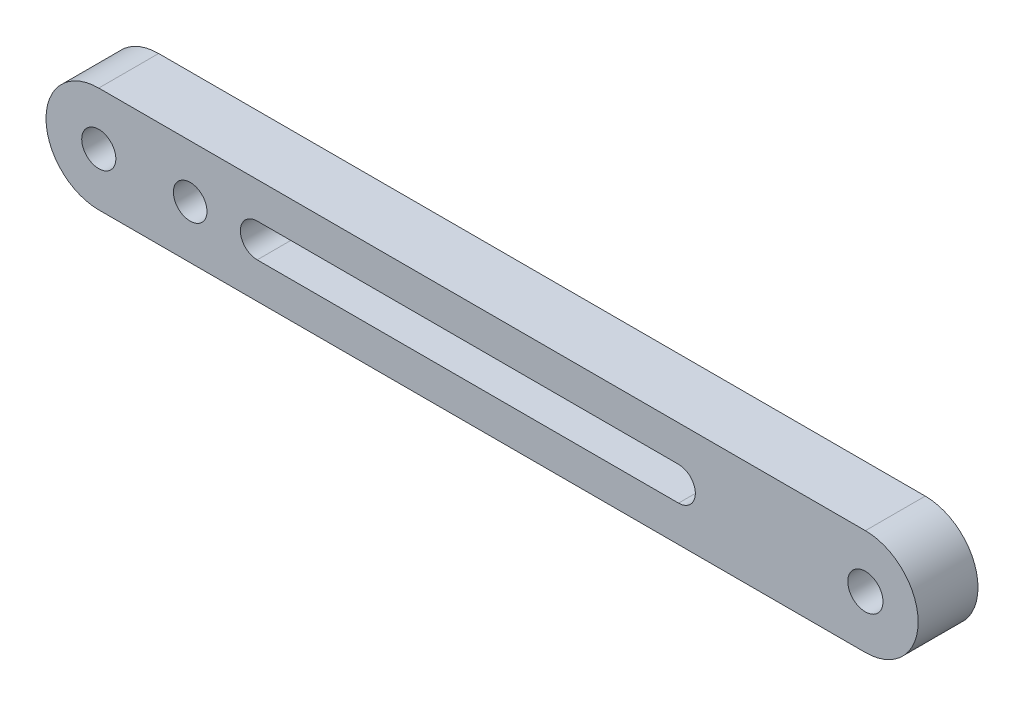
ISO-10303-21;
HEADER;
FILE_DESCRIPTION(('STEP AP214'),'2;1');
FILE_NAME('part.step','',(''),(''),'','','');
FILE_SCHEMA(('AUTOMOTIVE_DESIGN { 1 0 10303 214 1 1 1 1 }'));
ENDSEC;
DATA;
#1=APPLICATION_CONTEXT('core data for automotive mechanical design processes');
#2=APPLICATION_PROTOCOL_DEFINITION('international standard','automotive_design',2000,#1);
#3=PRODUCT_CONTEXT('',#1,'mechanical');
#4=PRODUCT('Part','Part','',(#3));
#5=PRODUCT_RELATED_PRODUCT_CATEGORY('part','',(#4));
#6=PRODUCT_DEFINITION_FORMATION('','',#4);
#7=PRODUCT_DEFINITION_CONTEXT('part definition',#1,'design');
#8=PRODUCT_DEFINITION('design','',#6,#7);
#9=PRODUCT_DEFINITION_SHAPE('','',#8);
#10=(LENGTH_UNIT() NAMED_UNIT(*) SI_UNIT(.MILLI.,.METRE.));
#11=(NAMED_UNIT(*) PLANE_ANGLE_UNIT() SI_UNIT($,.RADIAN.));
#12=(NAMED_UNIT(*) SI_UNIT($,.STERADIAN.) SOLID_ANGLE_UNIT());
#13=UNCERTAINTY_MEASURE_WITH_UNIT(LENGTH_MEASURE(1.E-05),#10,'distance_accuracy_value','');
#14=(GEOMETRIC_REPRESENTATION_CONTEXT(3) GLOBAL_UNCERTAINTY_ASSIGNED_CONTEXT((#13)) GLOBAL_UNIT_ASSIGNED_CONTEXT((#10,
#11,#12)) REPRESENTATION_CONTEXT('',''));
#15=CARTESIAN_POINT('',(0.,0.,0.));
#16=DIRECTION('',(0.,0.,1.));
#17=DIRECTION('',(1.,0.,0.));
#18=AXIS2_PLACEMENT_3D('',#15,#16,#17);
#19=CARTESIAN_POINT('',(49.4529730298948,15.8760123838213,19.6628463018496));
#20=DIRECTION('',(0.,0.,-1.));
#21=DIRECTION('',(-1.,0.,0.));
#22=AXIS2_PLACEMENT_3D('',#19,#20,#21);
#23=CYLINDRICAL_SURFACE('',#22,5.025);
#24=DIRECTION('',(0.,0.,-1.));
#25=VECTOR('',#24,1.);
#26=CARTESIAN_POINT('',(49.4529730298948,10.8510123838213,5.45));
#27=LINE('',#26,#25);
#28=CARTESIAN_POINT('',(49.4529730298948,10.8510123838213,5.45));
#29=VERTEX_POINT('',#28);
#30=CARTESIAN_POINT('',(49.4529730298948,10.8510123838213,-0.25));
#31=VERTEX_POINT('',#30);
#32=EDGE_CURVE('E11',#29,#31,#27,.T.);
#33=ORIENTED_EDGE('',*,*,#32,.T.);
#34=CARTESIAN_POINT('',(49.4529730298948,15.8760123838213,-0.25));
#35=DIRECTION('',(0.,0.,1.));
#36=DIRECTION('',(1.,0.,0.));
#37=AXIS2_PLACEMENT_3D('',#34,#35,#36);
#38=CIRCLE('',#37,5.025);
#39=CARTESIAN_POINT('',(49.4529730298948,20.9010123838213,-0.250000000000001));
#40=VERTEX_POINT('',#39);
#41=EDGE_CURVE('E161',#40,#31,#38,.F.);
#42=ORIENTED_EDGE('',*,*,#41,.F.);
#43=DIRECTION('',(0.,0.,-1.));
#44=VECTOR('',#43,1.);
#45=CARTESIAN_POINT('',(49.4529730298947,20.9010123838213,5.45));
#46=LINE('',#45,#44);
#47=CARTESIAN_POINT('',(49.4529730298947,20.9010123838213,5.45));
#48=VERTEX_POINT('',#47);
#49=EDGE_CURVE('E44',#48,#40,#46,.T.);
#50=ORIENTED_EDGE('',*,*,#49,.F.);
#51=CARTESIAN_POINT('',(49.4529730298948,15.8760123838213,5.45));
#52=DIRECTION('',(0.,0.,1.));
#53=DIRECTION('',(1.,0.,0.));
#54=AXIS2_PLACEMENT_3D('',#51,#52,#53);
#55=CIRCLE('',#54,5.025);
#56=EDGE_CURVE('E169',#48,#29,#55,.F.);
#57=ORIENTED_EDGE('',*,*,#56,.T.);
#58=EDGE_LOOP('',(#33,#42,#50,#57));
#59=FACE_BOUND('',#58,.T.);
#60=ADVANCED_FACE('F35',(#59),#23,.T.);
#61=CARTESIAN_POINT('',(-0.547026970105245,10.8510123838213,2.2));
#62=DIRECTION('',(0.,1.,0.));
#63=DIRECTION('',(-1.,0.,0.));
#64=AXIS2_PLACEMENT_3D('',#61,#62,#63);
#65=PLANE('',#64);
#66=DIRECTION('',(0.,0.,-1.));
#67=VECTOR('',#66,1.);
#68=CARTESIAN_POINT('',(-23.5470269701052,10.8510123838213,84.1195819551623));
#69=LINE('',#68,#67);
#70=CARTESIAN_POINT('',(-23.5470269701052,10.8510123838213,5.45000000000002));
#71=VERTEX_POINT('',#70);
#72=CARTESIAN_POINT('',(-23.5470269701052,10.8510123838213,-0.25));
#73=VERTEX_POINT('',#72);
#74=EDGE_CURVE('E151',#71,#73,#69,.T.);
#75=ORIENTED_EDGE('',*,*,#74,.T.);
#76=DIRECTION('',(1.,0.,0.));
#77=VECTOR('',#76,1.);
#78=CARTESIAN_POINT('',(-0.547026970105245,10.8510123838213,-0.25));
#79=LINE('',#78,#77);
#80=EDGE_CURVE('E166',#73,#31,#79,.T.);
#81=ORIENTED_EDGE('',*,*,#80,.T.);
#82=ORIENTED_EDGE('',*,*,#32,.F.);
#83=DIRECTION('',(1.,0.,0.));
#84=VECTOR('',#83,1.);
#85=CARTESIAN_POINT('',(-0.547026970105245,10.8510123838213,5.45));
#86=LINE('',#85,#84);
#87=EDGE_CURVE('E172',#71,#29,#86,.T.);
#88=ORIENTED_EDGE('',*,*,#87,.F.);
#89=EDGE_LOOP('',(#75,#81,#82,#88));
#90=FACE_BOUND('',#89,.T.);
#91=ADVANCED_FACE('F37',(#90),#65,.F.);
#92=CARTESIAN_POINT('',(-0.547026970105245,20.9010123838213,2.2));
#93=DIRECTION('',(0.,-1.,0.));
#94=DIRECTION('',(0.,0.,-1.));
#95=AXIS2_PLACEMENT_3D('',#92,#93,#94);
#96=PLANE('',#95);
#97=DIRECTION('',(-1.,0.,0.));
#98=VECTOR('',#97,1.);
#99=CARTESIAN_POINT('',(-0.547026970105245,20.9010123838213,-0.25));
#100=LINE('',#99,#98);
#101=CARTESIAN_POINT('',(-23.5470269701052,20.9010123838213,-0.25));
#102=VERTEX_POINT('',#101);
#103=EDGE_CURVE('E164',#40,#102,#100,.T.);
#104=ORIENTED_EDGE('',*,*,#103,.T.);
#105=DIRECTION('',(0.,0.,-1.));
#106=VECTOR('',#105,1.);
#107=CARTESIAN_POINT('',(-23.5470269701052,20.9010123838213,84.1195819551623));
#108=LINE('',#107,#106);
#109=CARTESIAN_POINT('',(-23.5470269701052,20.9010123838213,5.45));
#110=VERTEX_POINT('',#109);
#111=EDGE_CURVE('E156',#110,#102,#108,.T.);
#112=ORIENTED_EDGE('',*,*,#111,.F.);
#113=DIRECTION('',(-1.,0.,0.));
#114=VECTOR('',#113,1.);
#115=CARTESIAN_POINT('',(-0.547026970105245,20.9010123838213,5.45));
#116=LINE('',#115,#114);
#117=EDGE_CURVE('E174',#48,#110,#116,.T.);
#118=ORIENTED_EDGE('',*,*,#117,.F.);
#119=ORIENTED_EDGE('',*,*,#49,.T.);
#120=EDGE_LOOP('',(#104,#112,#118,#119));
#121=FACE_BOUND('',#120,.T.);
#122=ADVANCED_FACE('F185',(#121),#96,.F.);
#123=CARTESIAN_POINT('',(0.,0.,5.45));
#124=DIRECTION('',(0.,0.,1.));
#125=DIRECTION('',(1.,0.,0.));
#126=AXIS2_PLACEMENT_3D('',#123,#124,#125);
#127=PLANE('',#126);
#128=CARTESIAN_POINT('',(31.6615972046539,15.8760123838213,5.45));
#129=DIRECTION('',(0.,0.,1.));
#130=DIRECTION('',(1.,0.,0.));
#131=AXIS2_PLACEMENT_3D('',#128,#129,#130);
#132=CIRCLE('',#131,1.6);
#133=CARTESIAN_POINT('',(31.6615972046539,14.2760123838213,5.45));
#134=VERTEX_POINT('',#133);
#135=CARTESIAN_POINT('',(31.6615972046539,17.4760123838213,5.45));
#136=VERTEX_POINT('',#135);
#137=EDGE_CURVE('E141',#134,#136,#132,.T.);
#138=ORIENTED_EDGE('',*,*,#137,.F.);
#139=DIRECTION('',(1.,0.,0.));
#140=VECTOR('',#139,1.);
#141=CARTESIAN_POINT('',(0.,14.2760123838213,5.45));
#142=LINE('',#141,#140);
#143=CARTESIAN_POINT('',(-8.46104692687208,14.2760123838213,5.45));
#144=VERTEX_POINT('',#143);
#145=EDGE_CURVE('E136',#144,#134,#142,.T.);
#146=ORIENTED_EDGE('',*,*,#145,.F.);
#147=CARTESIAN_POINT('',(-8.46104692687208,15.8760123838213,5.45));
#148=DIRECTION('',(0.,0.,1.));
#149=DIRECTION('',(1.,0.,0.));
#150=AXIS2_PLACEMENT_3D('',#147,#148,#149);
#151=CIRCLE('',#150,1.6);
#152=CARTESIAN_POINT('',(-8.46104692687208,17.4760123838213,5.45));
#153=VERTEX_POINT('',#152);
#154=EDGE_CURVE('E108',#153,#144,#151,.T.);
#155=ORIENTED_EDGE('',*,*,#154,.F.);
#156=DIRECTION('',(-1.,0.,0.));
#157=VECTOR('',#156,1.);
#158=CARTESIAN_POINT('',(0.,17.4760123838213,5.45));
#159=LINE('',#158,#157);
#160=EDGE_CURVE('E139',#136,#153,#159,.T.);
#161=ORIENTED_EDGE('',*,*,#160,.F.);
#162=EDGE_LOOP('',(#138,#146,#155,#161));
#163=FACE_BOUND('',#162,.T.);
#164=CARTESIAN_POINT('',(-14.843182560384,15.8760123838213,5.45));
#165=DIRECTION('',(0.,0.,1.));
#166=DIRECTION('',(1.,0.,0.));
#167=AXIS2_PLACEMENT_3D('',#164,#165,#166);
#168=CIRCLE('',#167,1.6);
#169=CARTESIAN_POINT('',(-13.243182560384,15.8760123838213,5.45));
#170=VERTEX_POINT('',#169);
#171=EDGE_CURVE('E128',#170,#170,#168,.T.);
#172=ORIENTED_EDGE('',*,*,#171,.F.);
#173=EDGE_LOOP('',(#172));
#174=FACE_BOUND('',#173,.T.);
#175=CARTESIAN_POINT('',(49.4529730298948,15.8760123838213,5.45));
#176=DIRECTION('',(0.,0.,1.));
#177=DIRECTION('',(1.,0.,0.));
#178=AXIS2_PLACEMENT_3D('',#175,#176,#177);
#179=CIRCLE('',#178,1.675);
#180=CARTESIAN_POINT('',(51.1279730298948,15.8760123838213,5.45));
#181=VERTEX_POINT('',#180);
#182=EDGE_CURVE('E168',#181,#181,#179,.T.);
#183=ORIENTED_EDGE('',*,*,#182,.F.);
#184=EDGE_LOOP('',(#183));
#185=FACE_BOUND('',#184,.T.);
#186=ORIENTED_EDGE('',*,*,#87,.T.);
#187=ORIENTED_EDGE('',*,*,#56,.F.);
#188=ORIENTED_EDGE('',*,*,#117,.T.);
#189=CARTESIAN_POINT('',(-23.5470269701052,15.8760123838213,5.45));
#190=DIRECTION('',(0.,0.,1.));
#191=DIRECTION('',(1.,0.,0.));
#192=AXIS2_PLACEMENT_3D('',#189,#190,#191);
#193=CIRCLE('',#192,5.02499999999999);
#194=EDGE_CURVE('E143',#71,#110,#193,.F.);
#195=ORIENTED_EDGE('',*,*,#194,.F.);
#196=EDGE_LOOP('',(#186,#187,#188,#195));
#197=FACE_BOUND('',#196,.T.);
#198=CARTESIAN_POINT('',(-23.5470269701052,15.8760123838213,5.45));
#199=DIRECTION('',(0.,0.,1.));
#200=DIRECTION('',(1.,0.,0.));
#201=AXIS2_PLACEMENT_3D('',#198,#199,#200);
#202=CIRCLE('',#201,1.625);
#203=CARTESIAN_POINT('',(-25.1720269701052,15.8760123838213,5.44999999999998));
#204=VERTEX_POINT('',#203);
#205=EDGE_CURVE('E147',#204,#204,#202,.F.);
#206=ORIENTED_EDGE('',*,*,#205,.T.);
#207=EDGE_LOOP('',(#206));
#208=FACE_BOUND('',#207,.T.);
#209=ADVANCED_FACE('F182',(#163,#174,#185,#197,#208),#127,.T.);
#210=CARTESIAN_POINT('',(49.4529730298948,15.8760123838213,51.75));
#211=DIRECTION('',(0.,0.,-1.));
#212=DIRECTION('',(-1.,0.,0.));
#213=AXIS2_PLACEMENT_3D('',#210,#211,#212);
#214=CYLINDRICAL_SURFACE('',#213,1.675);
#215=ORIENTED_EDGE('',*,*,#182,.T.);
#216=EDGE_LOOP('',(#215));
#217=FACE_BOUND('',#216,.T.);
#218=CARTESIAN_POINT('',(49.4529730298948,15.8760123838213,-0.25));
#219=DIRECTION('',(0.,0.,1.));
#220=DIRECTION('',(1.,0.,0.));
#221=AXIS2_PLACEMENT_3D('',#218,#219,#220);
#222=CIRCLE('',#221,1.675);
#223=CARTESIAN_POINT('',(51.1279730298948,15.8760123838213,-0.25));
#224=VERTEX_POINT('',#223);
#225=EDGE_CURVE('E39',#224,#224,#222,.F.);
#226=ORIENTED_EDGE('',*,*,#225,.T.);
#227=EDGE_LOOP('',(#226));
#228=FACE_BOUND('',#227,.T.);
#229=ADVANCED_FACE('F179',(#217,#228),#214,.F.);
#230=CARTESIAN_POINT('',(0.,0.,-0.25));
#231=DIRECTION('',(0.,0.,1.));
#232=DIRECTION('',(1.,0.,0.));
#233=AXIS2_PLACEMENT_3D('',#230,#231,#232);
#234=PLANE('',#233);
#235=DIRECTION('',(-1.,0.,0.));
#236=VECTOR('',#235,1.);
#237=CARTESIAN_POINT('',(31.6615972046539,14.2760123838213,-0.25));
#238=LINE('',#237,#236);
#239=CARTESIAN_POINT('',(31.6615972046539,14.2760123838213,-0.25));
#240=VERTEX_POINT('',#239);
#241=CARTESIAN_POINT('',(-8.46104692687208,14.2760123838213,-0.25));
#242=VERTEX_POINT('',#241);
#243=EDGE_CURVE('E114',#240,#242,#238,.T.);
#244=ORIENTED_EDGE('',*,*,#243,.F.);
#245=CARTESIAN_POINT('',(31.6615972046539,15.8760123838213,-0.25));
#246=DIRECTION('',(0.,0.,-1.));
#247=DIRECTION('',(-1.,0.,0.));
#248=AXIS2_PLACEMENT_3D('',#245,#246,#247);
#249=CIRCLE('',#248,1.6);
#250=CARTESIAN_POINT('',(31.6615972046539,17.4760123838213,-0.25));
#251=VERTEX_POINT('',#250);
#252=EDGE_CURVE('E60',#251,#240,#249,.T.);
#253=ORIENTED_EDGE('',*,*,#252,.F.);
#254=DIRECTION('',(1.,0.,0.));
#255=VECTOR('',#254,1.);
#256=CARTESIAN_POINT('',(31.6615972046539,17.4760123838213,-0.25));
#257=LINE('',#256,#255);
#258=CARTESIAN_POINT('',(-8.46104692687208,17.4760123838213,-0.25));
#259=VERTEX_POINT('',#258);
#260=EDGE_CURVE('E121',#259,#251,#257,.T.);
#261=ORIENTED_EDGE('',*,*,#260,.F.);
#262=CARTESIAN_POINT('',(-8.46104692687208,15.8760123838213,-0.25));
#263=DIRECTION('',(0.,0.,-1.));
#264=DIRECTION('',(-1.,0.,0.));
#265=AXIS2_PLACEMENT_3D('',#262,#263,#264);
#266=CIRCLE('',#265,1.6);
#267=EDGE_CURVE('E105',#242,#259,#266,.T.);
#268=ORIENTED_EDGE('',*,*,#267,.F.);
#269=EDGE_LOOP('',(#244,#253,#261,#268));
#270=FACE_BOUND('',#269,.T.);
#271=CARTESIAN_POINT('',(-14.843182560384,15.8760123838213,-0.25));
#272=DIRECTION('',(0.,0.,-1.));
#273=DIRECTION('',(-1.,0.,0.));
#274=AXIS2_PLACEMENT_3D('',#271,#272,#273);
#275=CIRCLE('',#274,1.6);
#276=CARTESIAN_POINT('',(-16.443182560384,15.8760123838213,-0.25));
#277=VERTEX_POINT('',#276);
#278=EDGE_CURVE('E131',#277,#277,#275,.T.);
#279=ORIENTED_EDGE('',*,*,#278,.F.);
#280=EDGE_LOOP('',(#279));
#281=FACE_BOUND('',#280,.T.);
#282=ORIENTED_EDGE('',*,*,#80,.F.);
#283=CARTESIAN_POINT('',(-23.5470269701052,15.8760123838213,-0.25));
#284=DIRECTION('',(0.,0.,-1.));
#285=DIRECTION('',(1.,0.,0.));
#286=AXIS2_PLACEMENT_3D('',#283,#284,#285);
#287=CIRCLE('',#286,5.02499999999999);
#288=EDGE_CURVE('E144',#73,#102,#287,.T.);
#289=ORIENTED_EDGE('',*,*,#288,.T.);
#290=ORIENTED_EDGE('',*,*,#103,.F.);
#291=ORIENTED_EDGE('',*,*,#41,.T.);
#292=EDGE_LOOP('',(#282,#289,#290,#291));
#293=FACE_BOUND('',#292,.T.);
#294=ORIENTED_EDGE('',*,*,#225,.F.);
#295=EDGE_LOOP('',(#294));
#296=FACE_BOUND('',#295,.T.);
#297=CARTESIAN_POINT('',(-23.5470269701052,15.8760123838213,-0.25));
#298=DIRECTION('',(0.,0.,-1.));
#299=DIRECTION('',(-1.,0.,0.));
#300=AXIS2_PLACEMENT_3D('',#297,#298,#299);
#301=CIRCLE('',#300,1.625);
#302=CARTESIAN_POINT('',(-25.1720269701052,15.8760123838213,-0.25));
#303=VERTEX_POINT('',#302);
#304=EDGE_CURVE('E148',#303,#303,#301,.T.);
#305=ORIENTED_EDGE('',*,*,#304,.F.);
#306=EDGE_LOOP('',(#305));
#307=FACE_BOUND('',#306,.T.);
#308=ADVANCED_FACE('F118',(#270,#281,#293,#296,#307),#234,.F.);
#309=CARTESIAN_POINT('',(-23.5470269701052,15.8760123838213,84.1195819551623));
#310=DIRECTION('',(0.,0.,-1.));
#311=DIRECTION('',(-1.,0.,0.));
#312=AXIS2_PLACEMENT_3D('',#309,#310,#311);
#313=CYLINDRICAL_SURFACE('',#312,1.625);
#314=CARTESIAN_POINT('',(-25.1720269701052,15.8760123838213,-0.25));
#315=CARTESIAN_POINT('',(-25.1720269701052,15.8760123838213,-0.190625));
#316=CARTESIAN_POINT('',(-25.1720269701052,15.8760123838213,-0.131249999999999));
#317=CARTESIAN_POINT('',(-25.1720269701052,15.8760123838213,-0.0124999999999986));
#318=CARTESIAN_POINT('',(-25.1720269701052,15.8760123838213,0.0468750000000018));
#319=CARTESIAN_POINT('',(-25.1720269701052,15.8760123838213,0.165625000000003));
#320=CARTESIAN_POINT('',(-25.1720269701052,15.8760123838213,0.225000000000003));
#321=CARTESIAN_POINT('',(-25.1720269701052,15.8760123838213,0.343750000000004));
#322=CARTESIAN_POINT('',(-25.1720269701052,15.8760123838213,0.403125000000004));
#323=CARTESIAN_POINT('',(-25.1720269701052,15.8760123838213,0.521875));
#324=CARTESIAN_POINT('',(-25.1720269701052,15.8760123838213,0.581249999999996));
#325=CARTESIAN_POINT('',(-25.1720269701052,15.8760123838213,0.699999999999992));
#326=CARTESIAN_POINT('',(-25.1720269701052,15.8760123838213,0.759374999999993));
#327=CARTESIAN_POINT('',(-25.1720269701052,15.8760123838213,0.878124999999993));
#328=CARTESIAN_POINT('',(-25.1720269701052,15.8760123838213,0.937499999999994));
#329=CARTESIAN_POINT('',(-25.1720269701052,15.8760123838213,1.05624999999999));
#330=CARTESIAN_POINT('',(-25.1720269701052,15.8760123838213,1.115625));
#331=CARTESIAN_POINT('',(-25.1720269701052,15.8760123838213,1.234375));
#332=CARTESIAN_POINT('',(-25.1720269701052,15.8760123838213,1.29375));
#333=CARTESIAN_POINT('',(-25.1720269701052,15.8760123838213,1.4125));
#334=CARTESIAN_POINT('',(-25.1720269701052,15.8760123838213,1.471875));
#335=CARTESIAN_POINT('',(-25.1720269701052,15.8760123838213,1.590625));
#336=CARTESIAN_POINT('',(-25.1720269701052,15.8760123838213,1.65));
#337=CARTESIAN_POINT('',(-25.1720269701052,15.8760123838213,1.76874999999999));
#338=CARTESIAN_POINT('',(-25.1720269701052,15.8760123838213,1.82812499999999));
#339=CARTESIAN_POINT('',(-25.1720269701052,15.8760123838213,1.94687499999999));
#340=CARTESIAN_POINT('',(-25.1720269701052,15.8760123838213,2.00624999999999));
#341=CARTESIAN_POINT('',(-25.1720269701052,15.8760123838213,2.12499999999999));
#342=CARTESIAN_POINT('',(-25.1720269701052,15.8760123838213,2.18437499999999));
#343=CARTESIAN_POINT('',(-25.1720269701052,15.8760123838213,2.30312499999999));
#344=CARTESIAN_POINT('',(-25.1720269701052,15.8760123838213,2.36249999999999));
#345=CARTESIAN_POINT('',(-25.1720269701052,15.8760123838213,2.48124999999999));
#346=CARTESIAN_POINT('',(-25.1720269701052,15.8760123838213,2.54062499999999));
#347=CARTESIAN_POINT('',(-25.1720269701052,15.8760123838213,2.65937499999999));
#348=CARTESIAN_POINT('',(-25.1720269701052,15.8760123838213,2.71874999999999));
#349=CARTESIAN_POINT('',(-25.1720269701052,15.8760123838213,2.83749999999999));
#350=CARTESIAN_POINT('',(-25.1720269701052,15.8760123838213,2.89687499999999));
#351=CARTESIAN_POINT('',(-25.1720269701052,15.8760123838213,3.01562499999999));
#352=CARTESIAN_POINT('',(-25.1720269701052,15.8760123838213,3.07499999999999));
#353=CARTESIAN_POINT('',(-25.1720269701052,15.8760123838213,3.19375));
#354=CARTESIAN_POINT('',(-25.1720269701052,15.8760123838213,3.253125));
#355=CARTESIAN_POINT('',(-25.1720269701052,15.8760123838213,3.37187499999999));
#356=CARTESIAN_POINT('',(-25.1720269701052,15.8760123838213,3.43124999999999));
#357=CARTESIAN_POINT('',(-25.1720269701052,15.8760123838213,3.54999999999998));
#358=CARTESIAN_POINT('',(-25.1720269701052,15.8760123838213,3.60937499999998));
#359=CARTESIAN_POINT('',(-25.1720269701052,15.8760123838213,3.72812499999998));
#360=CARTESIAN_POINT('',(-25.1720269701052,15.8760123838213,3.78749999999999));
#361=CARTESIAN_POINT('',(-25.1720269701052,15.8760123838213,3.90624999999999));
#362=CARTESIAN_POINT('',(-25.1720269701052,15.8760123838213,3.96562499999999));
#363=CARTESIAN_POINT('',(-25.1720269701052,15.8760123838213,4.08437499999999));
#364=CARTESIAN_POINT('',(-25.1720269701052,15.8760123838213,4.14374999999999));
#365=CARTESIAN_POINT('',(-25.1720269701052,15.8760123838213,4.26249999999999));
#366=CARTESIAN_POINT('',(-25.1720269701052,15.8760123838213,4.32187499999999));
#367=CARTESIAN_POINT('',(-25.1720269701052,15.8760123838213,4.44062499999999));
#368=CARTESIAN_POINT('',(-25.1720269701052,15.8760123838213,4.49999999999999));
#369=CARTESIAN_POINT('',(-25.1720269701052,15.8760123838213,4.61874999999999));
#370=CARTESIAN_POINT('',(-25.1720269701052,15.8760123838213,4.67812499999998));
#371=CARTESIAN_POINT('',(-25.1720269701052,15.8760123838213,4.79687499999998));
#372=CARTESIAN_POINT('',(-25.1720269701052,15.8760123838213,4.85624999999998));
#373=CARTESIAN_POINT('',(-25.1720269701052,15.8760123838213,4.97499999999998));
#374=CARTESIAN_POINT('',(-25.1720269701052,15.8760123838213,5.03437499999998));
#375=CARTESIAN_POINT('',(-25.1720269701052,15.8760123838213,5.15312499999998));
#376=CARTESIAN_POINT('',(-25.1720269701052,15.8760123838213,5.21249999999998));
#377=CARTESIAN_POINT('',(-25.1720269701052,15.8760123838213,5.33124999999998));
#378=CARTESIAN_POINT('',(-25.1720269701052,15.8760123838213,5.39062499999998));
#379=CARTESIAN_POINT('',(-25.1720269701052,15.8760123838213,5.44999999999998));
#380=B_SPLINE_CURVE_WITH_KNOTS('',3,(#314,#315,#316,#317,#318,#319,#320,#321,#322,#323,#324,
#325,#326,#327,#328,#329,#330,#331,#332,#333,#334,#335,#336,#337,#338,#339,#340,#341,#342,#343,
#344,#345,#346,#347,#348,#349,#350,#351,#352,#353,#354,#355,#356,#357,#358,#359,#360,#361,#362,
#363,#364,#365,#366,#367,#368,#369,#370,#371,#372,#373,#374,#375,#376,#377,#378,#379),
.UNSPECIFIED.,.F.,.F.,(4,2,2,2,2,2,2,2,2,2,2,2,2,2,2,2,2,2,2,2,2,2,2,2,2,2,2,2,2,2,2,2,4),(0.,
0.178125000000001,0.356250000000002,0.534375000000004,0.712500000000005,0.890624999999992,
1.06874999999999,1.24687499999999,1.425,1.603125,1.78125,1.959375,2.13749999999999,
2.31562499999999,2.49374999999999,2.67187499999999,2.84999999999999,3.02812499999999,
3.20624999999999,3.384375,3.5625,3.74062499999998,3.91874999999998,4.09687499999999,
4.27499999999999,4.45312499999999,4.63124999999999,4.80937499999999,4.98749999999998,
5.16562499999998,5.34374999999998,5.52187499999998,5.69999999999998),.UNSPECIFIED.);
#381=EDGE_CURVE('BSEAM194',#303,#204,#380,.T.);
#382=ORIENTED_EDGE('',*,*,#304,.T.);
#383=ORIENTED_EDGE('',*,*,#205,.F.);
#384=ORIENTED_EDGE('',*,*,#381,.T.);
#385=ORIENTED_EDGE('',*,*,#381,.F.);
#386=EDGE_LOOP('',(#382,#384,#383,#385));
#387=FACE_BOUND('',#386,.T.);
#388=ADVANCED_FACE('F194',(#387),#313,.F.);
#389=CARTESIAN_POINT('',(-23.5470269701052,15.8760123838213,84.1195819551623));
#390=DIRECTION('',(0.,0.,-1.));
#391=DIRECTION('',(-1.,0.,0.));
#392=AXIS2_PLACEMENT_3D('',#389,#390,#391);
#393=CYLINDRICAL_SURFACE('',#392,5.02499999999999);
#394=ORIENTED_EDGE('',*,*,#74,.F.);
#395=ORIENTED_EDGE('',*,*,#194,.T.);
#396=ORIENTED_EDGE('',*,*,#111,.T.);
#397=ORIENTED_EDGE('',*,*,#288,.F.);
#398=EDGE_LOOP('',(#394,#395,#396,#397));
#399=FACE_BOUND('',#398,.T.);
#400=ADVANCED_FACE('F196',(#399),#393,.T.);
#401=CARTESIAN_POINT('',(-14.843182560384,15.8760123838213,5.75));
#402=DIRECTION('',(0.,0.,-1.));
#403=DIRECTION('',(-1.,0.,0.));
#404=AXIS2_PLACEMENT_3D('',#401,#402,#403);
#405=CYLINDRICAL_SURFACE('',#404,1.6);
#406=ORIENTED_EDGE('',*,*,#171,.T.);
#407=EDGE_LOOP('',(#406));
#408=FACE_BOUND('',#407,.T.);
#409=ORIENTED_EDGE('',*,*,#278,.T.);
#410=EDGE_LOOP('',(#409));
#411=FACE_BOUND('',#410,.T.);
#412=ADVANCED_FACE('F203',(#408,#411),#405,.F.);
#413=CARTESIAN_POINT('',(31.6615972046539,15.8760123838213,5.75));
#414=DIRECTION('',(0.,0.,-1.));
#415=DIRECTION('',(-1.,0.,0.));
#416=AXIS2_PLACEMENT_3D('',#413,#414,#415);
#417=CYLINDRICAL_SURFACE('',#416,1.6);
#418=ORIENTED_EDGE('',*,*,#137,.T.);
#419=DIRECTION('',(0.,0.,-1.));
#420=VECTOR('',#419,1.);
#421=CARTESIAN_POINT('',(31.6615972046539,17.4760123838213,5.75));
#422=LINE('',#421,#420);
#423=EDGE_CURVE('E126',#136,#251,#422,.T.);
#424=ORIENTED_EDGE('',*,*,#423,.T.);
#425=ORIENTED_EDGE('',*,*,#252,.T.);
#426=DIRECTION('',(0.,0.,-1.));
#427=VECTOR('',#426,1.);
#428=CARTESIAN_POINT('',(31.6615972046539,14.2760123838213,5.75));
#429=LINE('',#428,#427);
#430=EDGE_CURVE('E111',#134,#240,#429,.T.);
#431=ORIENTED_EDGE('',*,*,#430,.F.);
#432=EDGE_LOOP('',(#418,#424,#425,#431));
#433=FACE_BOUND('',#432,.T.);
#434=ADVANCED_FACE('F251',(#433),#417,.F.);
#435=CARTESIAN_POINT('',(31.6615972046539,17.4760123838213,5.75));
#436=DIRECTION('',(0.,1.,0.));
#437=DIRECTION('',(0.,0.,1.));
#438=AXIS2_PLACEMENT_3D('',#435,#436,#437);
#439=PLANE('',#438);
#440=ORIENTED_EDGE('',*,*,#160,.T.);
#441=DIRECTION('',(0.,0.,-1.));
#442=VECTOR('',#441,1.);
#443=CARTESIAN_POINT('',(-8.46104692687208,17.4760123838213,5.75));
#444=LINE('',#443,#442);
#445=EDGE_CURVE('E110',#153,#259,#444,.T.);
#446=ORIENTED_EDGE('',*,*,#445,.T.);
#447=ORIENTED_EDGE('',*,*,#260,.T.);
#448=ORIENTED_EDGE('',*,*,#423,.F.);
#449=EDGE_LOOP('',(#440,#446,#447,#448));
#450=FACE_BOUND('',#449,.T.);
#451=ADVANCED_FACE('F261',(#450),#439,.F.);
#452=CARTESIAN_POINT('',(-8.46104692687208,15.8760123838213,5.75));
#453=DIRECTION('',(0.,0.,-1.));
#454=DIRECTION('',(-1.,0.,0.));
#455=AXIS2_PLACEMENT_3D('',#452,#453,#454);
#456=CYLINDRICAL_SURFACE('',#455,1.6);
#457=ORIENTED_EDGE('',*,*,#154,.T.);
#458=DIRECTION('',(0.,0.,-1.));
#459=VECTOR('',#458,1.);
#460=CARTESIAN_POINT('',(-8.46104692687208,14.2760123838213,5.75));
#461=LINE('',#460,#459);
#462=EDGE_CURVE('E52',#144,#242,#461,.T.);
#463=ORIENTED_EDGE('',*,*,#462,.T.);
#464=ORIENTED_EDGE('',*,*,#267,.T.);
#465=ORIENTED_EDGE('',*,*,#445,.F.);
#466=EDGE_LOOP('',(#457,#463,#464,#465));
#467=FACE_BOUND('',#466,.T.);
#468=ADVANCED_FACE('F102',(#467),#456,.F.);
#469=CARTESIAN_POINT('',(31.6615972046539,14.2760123838213,5.75));
#470=DIRECTION('',(0.,-1.,0.));
#471=DIRECTION('',(0.,0.,-1.));
#472=AXIS2_PLACEMENT_3D('',#469,#470,#471);
#473=PLANE('',#472);
#474=ORIENTED_EDGE('',*,*,#145,.T.);
#475=ORIENTED_EDGE('',*,*,#430,.T.);
#476=ORIENTED_EDGE('',*,*,#243,.T.);
#477=ORIENTED_EDGE('',*,*,#462,.F.);
#478=EDGE_LOOP('',(#474,#475,#476,#477));
#479=FACE_BOUND('',#478,.T.);
#480=ADVANCED_FACE('F115',(#479),#473,.F.);
#481=CLOSED_SHELL('',(#60,#91,#122,#209,#229,#308,#388,#400,#412,#434,#451,#468,#480));
#482=MANIFOLD_SOLID_BREP('B2',#481);
#483=ADVANCED_BREP_SHAPE_REPRESENTATION('',(#18,#482),#14);
#484=SHAPE_DEFINITION_REPRESENTATION(#9,#483);
ENDSEC;
END-ISO-10303-21;
